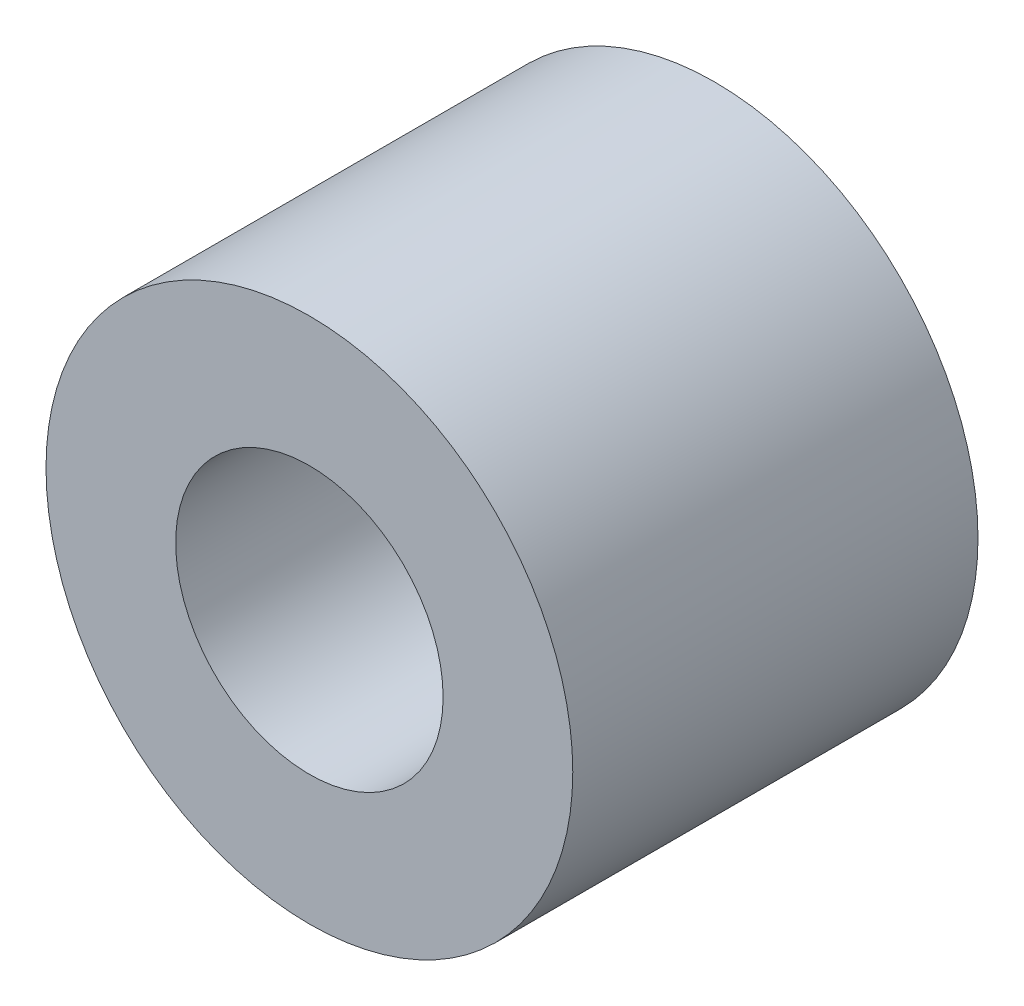
ISO-10303-21;
HEADER;
FILE_DESCRIPTION(('STEP AP214'),'2;1');
FILE_NAME('part.step','',(''),(''),'','','');
FILE_SCHEMA(('AUTOMOTIVE_DESIGN { 1 0 10303 214 1 1 1 1 }'));
ENDSEC;
DATA;
#1=APPLICATION_CONTEXT('core data for automotive mechanical design processes');
#2=APPLICATION_PROTOCOL_DEFINITION('international standard','automotive_design',2000,#1);
#3=PRODUCT_CONTEXT('',#1,'mechanical');
#4=PRODUCT('Part','Part','',(#3));
#5=PRODUCT_RELATED_PRODUCT_CATEGORY('part','',(#4));
#6=PRODUCT_DEFINITION_FORMATION('','',#4);
#7=PRODUCT_DEFINITION_CONTEXT('part definition',#1,'design');
#8=PRODUCT_DEFINITION('design','',#6,#7);
#9=PRODUCT_DEFINITION_SHAPE('','',#8);
#10=(LENGTH_UNIT() NAMED_UNIT(*) SI_UNIT(.MILLI.,.METRE.));
#11=(NAMED_UNIT(*) PLANE_ANGLE_UNIT() SI_UNIT($,.RADIAN.));
#12=(NAMED_UNIT(*) SI_UNIT($,.STERADIAN.) SOLID_ANGLE_UNIT());
#13=UNCERTAINTY_MEASURE_WITH_UNIT(LENGTH_MEASURE(1.E-05),#10,'distance_accuracy_value','');
#14=(GEOMETRIC_REPRESENTATION_CONTEXT(3) GLOBAL_UNCERTAINTY_ASSIGNED_CONTEXT((#13)) GLOBAL_UNIT_ASSIGNED_CONTEXT((#10,
#11,#12)) REPRESENTATION_CONTEXT('',''));
#15=CARTESIAN_POINT('',(0.,0.,0.));
#16=DIRECTION('',(0.,0.,1.));
#17=DIRECTION('',(1.,0.,0.));
#18=AXIS2_PLACEMENT_3D('',#15,#16,#17);
#19=CARTESIAN_POINT('',(0.,0.,5.));
#20=DIRECTION('',(0.,0.,1.));
#21=DIRECTION('',(1.,0.,0.));
#22=AXIS2_PLACEMENT_3D('',#19,#20,#21);
#23=PLANE('',#22);
#24=CARTESIAN_POINT('',(0.,0.,5.));
#25=DIRECTION('',(0.,0.,1.));
#26=DIRECTION('',(1.,0.,0.));
#27=AXIS2_PLACEMENT_3D('',#24,#25,#26);
#28=CIRCLE('',#27,3.25);
#29=CARTESIAN_POINT('',(3.25,0.,5.));
#30=VERTEX_POINT('',#29);
#31=EDGE_CURVE('E10',#30,#30,#28,.T.);
#32=ORIENTED_EDGE('',*,*,#31,.T.);
#33=EDGE_LOOP('',(#32));
#34=FACE_BOUND('',#33,.T.);
#35=CARTESIAN_POINT('',(0.,0.,5.));
#36=DIRECTION('',(0.,0.,1.));
#37=DIRECTION('',(1.,0.,0.));
#38=AXIS2_PLACEMENT_3D('',#35,#36,#37);
#39=CIRCLE('',#38,1.65);
#40=CARTESIAN_POINT('',(1.65,0.,5.));
#41=VERTEX_POINT('',#40);
#42=EDGE_CURVE('E42',#41,#41,#39,.T.);
#43=ORIENTED_EDGE('',*,*,#42,.F.);
#44=EDGE_LOOP('',(#43));
#45=FACE_BOUND('',#44,.T.);
#46=ADVANCED_FACE('F31',(#34,#45),#23,.T.);
#47=CARTESIAN_POINT('',(0.,0.,0.));
#48=DIRECTION('',(0.,0.,1.));
#49=DIRECTION('',(1.,0.,0.));
#50=AXIS2_PLACEMENT_3D('',#47,#48,#49);
#51=PLANE('',#50);
#52=CARTESIAN_POINT('',(0.,0.,0.));
#53=DIRECTION('',(0.,0.,1.));
#54=DIRECTION('',(1.,0.,0.));
#55=AXIS2_PLACEMENT_3D('',#52,#53,#54);
#56=CIRCLE('',#55,3.25);
#57=CARTESIAN_POINT('',(3.25,0.,0.));
#58=VERTEX_POINT('',#57);
#59=EDGE_CURVE('E35',#58,#58,#56,.T.);
#60=ORIENTED_EDGE('',*,*,#59,.F.);
#61=EDGE_LOOP('',(#60));
#62=FACE_BOUND('',#61,.T.);
#63=CARTESIAN_POINT('',(0.,0.,0.));
#64=DIRECTION('',(0.,0.,1.));
#65=DIRECTION('',(1.,0.,0.));
#66=AXIS2_PLACEMENT_3D('',#63,#64,#65);
#67=CIRCLE('',#66,1.65);
#68=CARTESIAN_POINT('',(1.65,0.,0.));
#69=VERTEX_POINT('',#68);
#70=EDGE_CURVE('E44',#69,#69,#67,.T.);
#71=ORIENTED_EDGE('',*,*,#70,.T.);
#72=EDGE_LOOP('',(#71));
#73=FACE_BOUND('',#72,.T.);
#74=ADVANCED_FACE('F54',(#62,#73),#51,.F.);
#75=CARTESIAN_POINT('',(0.,0.,5.));
#76=DIRECTION('',(0.,0.,-1.));
#77=DIRECTION('',(-1.,0.,0.));
#78=AXIS2_PLACEMENT_3D('',#75,#76,#77);
#79=CYLINDRICAL_SURFACE('',#78,3.25);
#80=ORIENTED_EDGE('',*,*,#31,.F.);
#81=EDGE_LOOP('',(#80));
#82=FACE_BOUND('',#81,.T.);
#83=ORIENTED_EDGE('',*,*,#59,.T.);
#84=EDGE_LOOP('',(#83));
#85=FACE_BOUND('',#84,.T.);
#86=ADVANCED_FACE('F33',(#82,#85),#79,.T.);
#87=CARTESIAN_POINT('',(0.,0.,5.));
#88=DIRECTION('',(0.,0.,-1.));
#89=DIRECTION('',(-1.,0.,0.));
#90=AXIS2_PLACEMENT_3D('',#87,#88,#89);
#91=CYLINDRICAL_SURFACE('',#90,1.65);
#92=ORIENTED_EDGE('',*,*,#42,.T.);
#93=EDGE_LOOP('',(#92));
#94=FACE_BOUND('',#93,.T.);
#95=ORIENTED_EDGE('',*,*,#70,.F.);
#96=EDGE_LOOP('',(#95));
#97=FACE_BOUND('',#96,.T.);
#98=ADVANCED_FACE('F50',(#94,#97),#91,.F.);
#99=CLOSED_SHELL('',(#46,#74,#86,#98));
#100=MANIFOLD_SOLID_BREP('B2',#99);
#101=ADVANCED_BREP_SHAPE_REPRESENTATION('',(#18,#100),#14);
#102=SHAPE_DEFINITION_REPRESENTATION(#9,#101);
ENDSEC;
END-ISO-10303-21;
